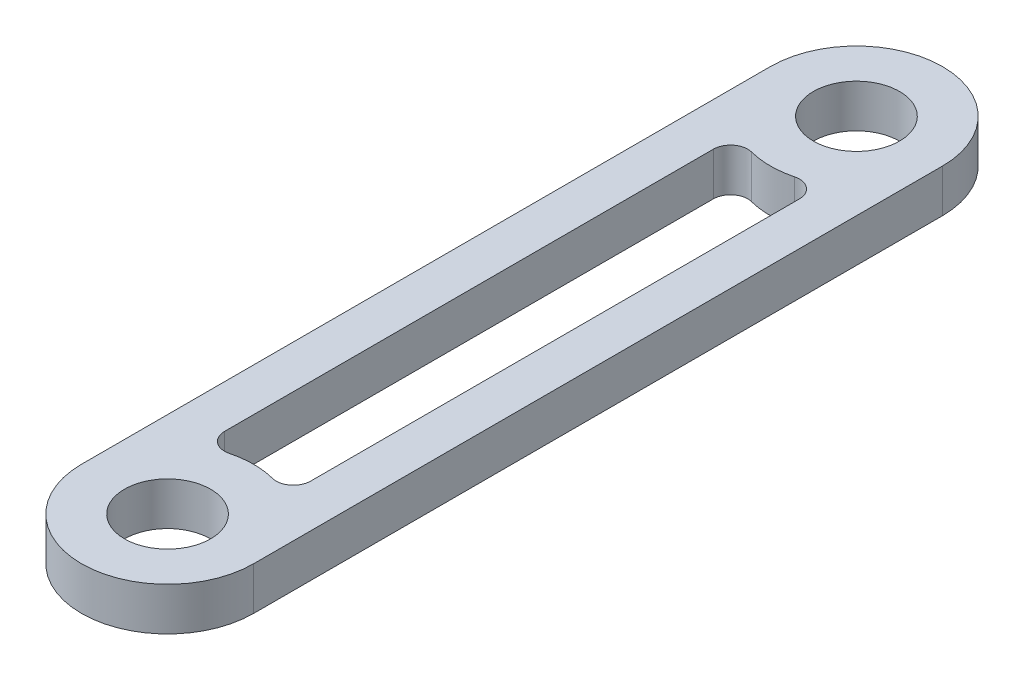
ISO-10303-21;
HEADER;
FILE_DESCRIPTION(('STEP AP214'),'2;1');
FILE_NAME('part.step','',(''),(''),'','','');
FILE_SCHEMA(('AUTOMOTIVE_DESIGN { 1 0 10303 214 1 1 1 1 }'));
ENDSEC;
DATA;
#1=APPLICATION_CONTEXT('core data for automotive mechanical design processes');
#2=APPLICATION_PROTOCOL_DEFINITION('international standard','automotive_design',2000,#1);
#3=PRODUCT_CONTEXT('',#1,'mechanical');
#4=PRODUCT('Part','Part','',(#3));
#5=PRODUCT_RELATED_PRODUCT_CATEGORY('part','',(#4));
#6=PRODUCT_DEFINITION_FORMATION('','',#4);
#7=PRODUCT_DEFINITION_CONTEXT('part definition',#1,'design');
#8=PRODUCT_DEFINITION('design','',#6,#7);
#9=PRODUCT_DEFINITION_SHAPE('','',#8);
#10=(LENGTH_UNIT() NAMED_UNIT(*) SI_UNIT(.MILLI.,.METRE.));
#11=(NAMED_UNIT(*) PLANE_ANGLE_UNIT() SI_UNIT($,.RADIAN.));
#12=(NAMED_UNIT(*) SI_UNIT($,.STERADIAN.) SOLID_ANGLE_UNIT());
#13=UNCERTAINTY_MEASURE_WITH_UNIT(LENGTH_MEASURE(1.E-05),#10,'distance_accuracy_value','');
#14=(GEOMETRIC_REPRESENTATION_CONTEXT(3) GLOBAL_UNCERTAINTY_ASSIGNED_CONTEXT((#13)) GLOBAL_UNIT_ASSIGNED_CONTEXT((#10,
#11,#12)) REPRESENTATION_CONTEXT('',''));
#15=CARTESIAN_POINT('',(0.,0.,0.));
#16=DIRECTION('',(0.,0.,1.));
#17=DIRECTION('',(1.,0.,0.));
#18=AXIS2_PLACEMENT_3D('',#15,#16,#17);
#19=CARTESIAN_POINT('',(0.,5.,0.));
#20=DIRECTION('',(0.,1.,0.));
#21=DIRECTION('',(0.,0.,1.));
#22=AXIS2_PLACEMENT_3D('',#19,#20,#21);
#23=PLANE('',#22);
#24=CARTESIAN_POINT('',(0.,5.,-80.));
#25=DIRECTION('',(0.,1.,0.));
#26=DIRECTION('',(0.,0.,1.));
#27=AXIS2_PLACEMENT_3D('',#24,#25,#26);
#28=CIRCLE('',#27,5.);
#29=CARTESIAN_POINT('',(0.,5.,-75.));
#30=VERTEX_POINT('',#29);
#31=EDGE_CURVE('E230',#30,#30,#28,.T.);
#32=ORIENTED_EDGE('',*,*,#31,.F.);
#33=EDGE_LOOP('',(#32));
#34=FACE_BOUND('',#33,.T.);
#35=CARTESIAN_POINT('',(0.,5.,0.));
#36=DIRECTION('',(0.,1.,0.));
#37=DIRECTION('',(0.,0.,1.));
#38=AXIS2_PLACEMENT_3D('',#35,#36,#37);
#39=CIRCLE('',#38,5.);
#40=CARTESIAN_POINT('',(0.,5.,5.));
#41=VERTEX_POINT('',#40);
#42=EDGE_CURVE('E153',#41,#41,#39,.T.);
#43=ORIENTED_EDGE('',*,*,#42,.F.);
#44=EDGE_LOOP('',(#43));
#45=FACE_BOUND('',#44,.T.);
#46=DIRECTION('',(0.,0.,1.));
#47=VECTOR('',#46,1.);
#48=CARTESIAN_POINT('',(-10.,5.,0.));
#49=LINE('',#48,#47);
#50=CARTESIAN_POINT('',(-10.,5.,-80.));
#51=VERTEX_POINT('',#50);
#52=CARTESIAN_POINT('',(-10.,5.,0.));
#53=VERTEX_POINT('',#52);
#54=EDGE_CURVE('E145',#51,#53,#49,.T.);
#55=ORIENTED_EDGE('',*,*,#54,.T.);
#56=CARTESIAN_POINT('',(0.,5.,0.));
#57=DIRECTION('',(0.,1.,0.));
#58=DIRECTION('',(0.,0.,1.));
#59=AXIS2_PLACEMENT_3D('',#56,#57,#58);
#60=CIRCLE('',#59,10.);
#61=CARTESIAN_POINT('',(10.,5.,0.));
#62=VERTEX_POINT('',#61);
#63=EDGE_CURVE('E135',#53,#62,#60,.T.);
#64=ORIENTED_EDGE('',*,*,#63,.T.);
#65=DIRECTION('',(0.,0.,1.));
#66=VECTOR('',#65,1.);
#67=CARTESIAN_POINT('',(10.,5.,0.));
#68=LINE('',#67,#66);
#69=CARTESIAN_POINT('',(10.,5.,-80.));
#70=VERTEX_POINT('',#69);
#71=EDGE_CURVE('E141',#70,#62,#68,.T.);
#72=ORIENTED_EDGE('',*,*,#71,.F.);
#73=CARTESIAN_POINT('',(0.,5.,-80.));
#74=DIRECTION('',(0.,1.,0.));
#75=DIRECTION('',(0.,0.,1.));
#76=AXIS2_PLACEMENT_3D('',#73,#74,#75);
#77=CIRCLE('',#76,10.);
#78=EDGE_CURVE('E149',#70,#51,#77,.T.);
#79=ORIENTED_EDGE('',*,*,#78,.T.);
#80=EDGE_LOOP('',(#55,#64,#72,#79));
#81=FACE_BOUND('',#80,.T.);
#82=DIRECTION('',(0.,0.,1.));
#83=VECTOR('',#82,1.);
#84=CARTESIAN_POINT('',(-5.,5.,0.));
#85=LINE('',#84,#83);
#86=CARTESIAN_POINT('',(-5.00000000000001,5.,-68.3810499613777));
#87=VERTEX_POINT('',#86);
#88=CARTESIAN_POINT('',(-5.,5.,-11.6189500386223));
#89=VERTEX_POINT('',#88);
#90=EDGE_CURVE('E197',#87,#89,#85,.T.);
#91=ORIENTED_EDGE('',*,*,#90,.F.);
#92=CARTESIAN_POINT('',(-3.00000000000001,5.,-68.3810499613777));
#93=DIRECTION('',(0.,1.,0.));
#94=DIRECTION('',(0.,0.,1.));
#95=AXIS2_PLACEMENT_3D('',#92,#93,#94);
#96=CIRCLE('',#95,2.);
#97=CARTESIAN_POINT('',(-2.50000000000001,5.,-70.3175416344814));
#98=VERTEX_POINT('',#97);
#99=EDGE_CURVE('E51',#87,#98,#96,.F.);
#100=ORIENTED_EDGE('',*,*,#99,.T.);
#101=CARTESIAN_POINT('',(0.,5.,-80.));
#102=DIRECTION('',(0.,1.,0.));
#103=DIRECTION('',(0.,0.,1.));
#104=AXIS2_PLACEMENT_3D('',#101,#102,#103);
#105=CIRCLE('',#104,10.);
#106=CARTESIAN_POINT('',(2.5,5.,-70.3175416344814));
#107=VERTEX_POINT('',#106);
#108=EDGE_CURVE('E198',#98,#107,#105,.T.);
#109=ORIENTED_EDGE('',*,*,#108,.T.);
#110=CARTESIAN_POINT('',(3.,5.,-68.3810499613777));
#111=DIRECTION('',(0.,1.,0.));
#112=DIRECTION('',(0.,0.,1.));
#113=AXIS2_PLACEMENT_3D('',#110,#111,#112);
#114=CIRCLE('',#113,2.);
#115=CARTESIAN_POINT('',(5.,5.,-68.3810499613777));
#116=VERTEX_POINT('',#115);
#117=EDGE_CURVE('E185',#107,#116,#114,.F.);
#118=ORIENTED_EDGE('',*,*,#117,.T.);
#119=DIRECTION('',(0.,0.,1.));
#120=VECTOR('',#119,1.);
#121=CARTESIAN_POINT('',(5.00000000000001,5.,0.));
#122=LINE('',#121,#120);
#123=CARTESIAN_POINT('',(5.00000000000001,5.,-11.6189500386222));
#124=VERTEX_POINT('',#123);
#125=EDGE_CURVE('E214',#116,#124,#122,.T.);
#126=ORIENTED_EDGE('',*,*,#125,.T.);
#127=CARTESIAN_POINT('',(3.00000000000001,5.,-11.6189500386222));
#128=DIRECTION('',(0.,1.,0.));
#129=DIRECTION('',(0.,0.,1.));
#130=AXIS2_PLACEMENT_3D('',#127,#128,#129);
#131=CIRCLE('',#130,2.);
#132=CARTESIAN_POINT('',(2.50000000000001,5.,-9.68245836551854));
#133=VERTEX_POINT('',#132);
#134=EDGE_CURVE('E188',#124,#133,#131,.F.);
#135=ORIENTED_EDGE('',*,*,#134,.T.);
#136=CARTESIAN_POINT('',(0.,5.,0.));
#137=DIRECTION('',(0.,1.,0.));
#138=DIRECTION('',(0.,0.,1.));
#139=AXIS2_PLACEMENT_3D('',#136,#137,#138);
#140=CIRCLE('',#139,10.);
#141=CARTESIAN_POINT('',(-2.5,5.,-9.68245836551854));
#142=VERTEX_POINT('',#141);
#143=EDGE_CURVE('E225',#133,#142,#140,.T.);
#144=ORIENTED_EDGE('',*,*,#143,.T.);
#145=CARTESIAN_POINT('',(-3.,5.,-11.6189500386223));
#146=DIRECTION('',(0.,1.,0.));
#147=DIRECTION('',(0.,0.,1.));
#148=AXIS2_PLACEMENT_3D('',#145,#146,#147);
#149=CIRCLE('',#148,2.);
#150=EDGE_CURVE('E187',#142,#89,#149,.F.);
#151=ORIENTED_EDGE('',*,*,#150,.T.);
#152=EDGE_LOOP('',(#91,#100,#109,#118,#126,#135,#144,#151));
#153=FACE_BOUND('',#152,.T.);
#154=ADVANCED_FACE('F43',(#34,#45,#81,#153),#23,.T.);
#155=CARTESIAN_POINT('',(0.,0.,0.));
#156=DIRECTION('',(0.,1.,0.));
#157=DIRECTION('',(0.,0.,1.));
#158=AXIS2_PLACEMENT_3D('',#155,#156,#157);
#159=PLANE('',#158);
#160=DIRECTION('',(0.,0.,1.));
#161=VECTOR('',#160,1.);
#162=CARTESIAN_POINT('',(-10.,0.,0.));
#163=LINE('',#162,#161);
#164=CARTESIAN_POINT('',(-10.,0.,-80.));
#165=VERTEX_POINT('',#164);
#166=CARTESIAN_POINT('',(-10.,0.,0.));
#167=VERTEX_POINT('',#166);
#168=EDGE_CURVE('E160',#165,#167,#163,.T.);
#169=ORIENTED_EDGE('',*,*,#168,.F.);
#170=CARTESIAN_POINT('',(0.,0.,-80.));
#171=DIRECTION('',(0.,1.,0.));
#172=DIRECTION('',(0.,0.,1.));
#173=AXIS2_PLACEMENT_3D('',#170,#171,#172);
#174=CIRCLE('',#173,10.);
#175=CARTESIAN_POINT('',(10.,0.,-80.));
#176=VERTEX_POINT('',#175);
#177=EDGE_CURVE('E227',#176,#165,#174,.T.);
#178=ORIENTED_EDGE('',*,*,#177,.F.);
#179=DIRECTION('',(0.,0.,1.));
#180=VECTOR('',#179,1.);
#181=CARTESIAN_POINT('',(10.,0.,0.));
#182=LINE('',#181,#180);
#183=CARTESIAN_POINT('',(10.,0.,0.));
#184=VERTEX_POINT('',#183);
#185=EDGE_CURVE('E244',#176,#184,#182,.T.);
#186=ORIENTED_EDGE('',*,*,#185,.T.);
#187=CARTESIAN_POINT('',(0.,0.,0.));
#188=DIRECTION('',(0.,1.,0.));
#189=DIRECTION('',(0.,0.,1.));
#190=AXIS2_PLACEMENT_3D('',#187,#188,#189);
#191=CIRCLE('',#190,10.);
#192=EDGE_CURVE('E245',#167,#184,#191,.T.);
#193=ORIENTED_EDGE('',*,*,#192,.F.);
#194=EDGE_LOOP('',(#169,#178,#186,#193));
#195=FACE_BOUND('',#194,.T.);
#196=CARTESIAN_POINT('',(0.,0.,0.));
#197=DIRECTION('',(0.,1.,0.));
#198=DIRECTION('',(0.,0.,1.));
#199=AXIS2_PLACEMENT_3D('',#196,#197,#198);
#200=CIRCLE('',#199,5.);
#201=CARTESIAN_POINT('',(0.,0.,5.));
#202=VERTEX_POINT('',#201);
#203=EDGE_CURVE('E236',#202,#202,#200,.T.);
#204=ORIENTED_EDGE('',*,*,#203,.T.);
#205=EDGE_LOOP('',(#204));
#206=FACE_BOUND('',#205,.T.);
#207=CARTESIAN_POINT('',(0.,0.,-80.));
#208=DIRECTION('',(0.,1.,0.));
#209=DIRECTION('',(0.,0.,1.));
#210=AXIS2_PLACEMENT_3D('',#207,#208,#209);
#211=CIRCLE('',#210,5.);
#212=CARTESIAN_POINT('',(0.,0.,-75.));
#213=VERTEX_POINT('',#212);
#214=EDGE_CURVE('E218',#213,#213,#211,.T.);
#215=ORIENTED_EDGE('',*,*,#214,.T.);
#216=EDGE_LOOP('',(#215));
#217=FACE_BOUND('',#216,.T.);
#218=CARTESIAN_POINT('',(0.,0.,-80.));
#219=DIRECTION('',(0.,1.,0.));
#220=DIRECTION('',(0.,0.,1.));
#221=AXIS2_PLACEMENT_3D('',#218,#219,#220);
#222=CIRCLE('',#221,10.);
#223=CARTESIAN_POINT('',(-2.50000000000001,0.,-70.3175416344814));
#224=VERTEX_POINT('',#223);
#225=CARTESIAN_POINT('',(2.5,0.,-70.3175416344814));
#226=VERTEX_POINT('',#225);
#227=EDGE_CURVE('E209',#224,#226,#222,.T.);
#228=ORIENTED_EDGE('',*,*,#227,.F.);
#229=CARTESIAN_POINT('',(-3.00000000000001,0.,-68.3810499613777));
#230=DIRECTION('',(0.,1.,0.));
#231=DIRECTION('',(0.,0.,1.));
#232=AXIS2_PLACEMENT_3D('',#229,#230,#231);
#233=CIRCLE('',#232,2.);
#234=CARTESIAN_POINT('',(-5.00000000000001,0.,-68.3810499613777));
#235=VERTEX_POINT('',#234);
#236=EDGE_CURVE('E11',#224,#235,#233,.T.);
#237=ORIENTED_EDGE('',*,*,#236,.T.);
#238=DIRECTION('',(0.,0.,1.));
#239=VECTOR('',#238,1.);
#240=CARTESIAN_POINT('',(-5.,0.,0.));
#241=LINE('',#240,#239);
#242=CARTESIAN_POINT('',(-5.,0.,-11.6189500386223));
#243=VERTEX_POINT('',#242);
#244=EDGE_CURVE('E210',#235,#243,#241,.T.);
#245=ORIENTED_EDGE('',*,*,#244,.T.);
#246=CARTESIAN_POINT('',(-3.,0.,-11.6189500386223));
#247=DIRECTION('',(0.,1.,0.));
#248=DIRECTION('',(0.,0.,1.));
#249=AXIS2_PLACEMENT_3D('',#246,#247,#248);
#250=CIRCLE('',#249,2.);
#251=CARTESIAN_POINT('',(-2.5,0.,-9.68245836551854));
#252=VERTEX_POINT('',#251);
#253=EDGE_CURVE('E195',#243,#252,#250,.T.);
#254=ORIENTED_EDGE('',*,*,#253,.T.);
#255=CARTESIAN_POINT('',(0.,0.,0.));
#256=DIRECTION('',(0.,1.,0.));
#257=DIRECTION('',(0.,0.,1.));
#258=AXIS2_PLACEMENT_3D('',#255,#256,#257);
#259=CIRCLE('',#258,10.);
#260=CARTESIAN_POINT('',(2.50000000000001,0.,-9.68245836551854));
#261=VERTEX_POINT('',#260);
#262=EDGE_CURVE('E207',#261,#252,#259,.T.);
#263=ORIENTED_EDGE('',*,*,#262,.F.);
#264=CARTESIAN_POINT('',(3.00000000000001,0.,-11.6189500386222));
#265=DIRECTION('',(0.,1.,0.));
#266=DIRECTION('',(0.,0.,1.));
#267=AXIS2_PLACEMENT_3D('',#264,#265,#266);
#268=CIRCLE('',#267,2.);
#269=CARTESIAN_POINT('',(5.00000000000001,0.,-11.6189500386222));
#270=VERTEX_POINT('',#269);
#271=EDGE_CURVE('E186',#261,#270,#268,.T.);
#272=ORIENTED_EDGE('',*,*,#271,.T.);
#273=DIRECTION('',(0.,0.,1.));
#274=VECTOR('',#273,1.);
#275=CARTESIAN_POINT('',(5.00000000000001,0.,0.));
#276=LINE('',#275,#274);
#277=CARTESIAN_POINT('',(5.,0.,-68.3810499613777));
#278=VERTEX_POINT('',#277);
#279=EDGE_CURVE('E213',#278,#270,#276,.T.);
#280=ORIENTED_EDGE('',*,*,#279,.F.);
#281=CARTESIAN_POINT('',(3.,0.,-68.3810499613777));
#282=DIRECTION('',(0.,1.,0.));
#283=DIRECTION('',(0.,0.,1.));
#284=AXIS2_PLACEMENT_3D('',#281,#282,#283);
#285=CIRCLE('',#284,2.);
#286=EDGE_CURVE('E184',#278,#226,#285,.T.);
#287=ORIENTED_EDGE('',*,*,#286,.T.);
#288=EDGE_LOOP('',(#228,#237,#245,#254,#263,#272,#280,#287));
#289=FACE_BOUND('',#288,.T.);
#290=ADVANCED_FACE('F255',(#195,#206,#217,#289),#159,.F.);
#291=CARTESIAN_POINT('',(-10.,5.,0.));
#292=DIRECTION('',(1.,0.,0.));
#293=DIRECTION('',(0.,0.,-1.));
#294=AXIS2_PLACEMENT_3D('',#291,#292,#293);
#295=PLANE('',#294);
#296=ORIENTED_EDGE('',*,*,#168,.T.);
#297=DIRECTION('',(0.,-1.,0.));
#298=VECTOR('',#297,1.);
#299=CARTESIAN_POINT('',(-10.,5.,0.));
#300=LINE('',#299,#298);
#301=EDGE_CURVE('E140',#53,#167,#300,.T.);
#302=ORIENTED_EDGE('',*,*,#301,.F.);
#303=ORIENTED_EDGE('',*,*,#54,.F.);
#304=DIRECTION('',(0.,-1.,0.));
#305=VECTOR('',#304,1.);
#306=CARTESIAN_POINT('',(-10.,5.,-80.));
#307=LINE('',#306,#305);
#308=EDGE_CURVE('E234',#51,#165,#307,.T.);
#309=ORIENTED_EDGE('',*,*,#308,.T.);
#310=EDGE_LOOP('',(#296,#302,#303,#309));
#311=FACE_BOUND('',#310,.T.);
#312=ADVANCED_FACE('F154',(#311),#295,.F.);
#313=CARTESIAN_POINT('',(0.,5.,0.));
#314=DIRECTION('',(0.,-1.,0.));
#315=DIRECTION('',(0.,0.,-1.));
#316=AXIS2_PLACEMENT_3D('',#313,#314,#315);
#317=CYLINDRICAL_SURFACE('',#316,10.);
#318=ORIENTED_EDGE('',*,*,#192,.T.);
#319=DIRECTION('',(0.,-1.,0.));
#320=VECTOR('',#319,1.);
#321=CARTESIAN_POINT('',(10.,5.,0.));
#322=LINE('',#321,#320);
#323=EDGE_CURVE('E137',#62,#184,#322,.T.);
#324=ORIENTED_EDGE('',*,*,#323,.F.);
#325=ORIENTED_EDGE('',*,*,#63,.F.);
#326=ORIENTED_EDGE('',*,*,#301,.T.);
#327=EDGE_LOOP('',(#318,#324,#325,#326));
#328=FACE_BOUND('',#327,.T.);
#329=ADVANCED_FACE('F132',(#328),#317,.T.);
#330=CARTESIAN_POINT('',(10.,5.,0.));
#331=DIRECTION('',(1.,0.,0.));
#332=DIRECTION('',(0.,0.,-1.));
#333=AXIS2_PLACEMENT_3D('',#330,#331,#332);
#334=PLANE('',#333);
#335=ORIENTED_EDGE('',*,*,#185,.F.);
#336=DIRECTION('',(0.,-1.,0.));
#337=VECTOR('',#336,1.);
#338=CARTESIAN_POINT('',(10.,5.,-80.));
#339=LINE('',#338,#337);
#340=EDGE_CURVE('E165',#70,#176,#339,.T.);
#341=ORIENTED_EDGE('',*,*,#340,.F.);
#342=ORIENTED_EDGE('',*,*,#71,.T.);
#343=ORIENTED_EDGE('',*,*,#323,.T.);
#344=EDGE_LOOP('',(#335,#341,#342,#343));
#345=FACE_BOUND('',#344,.T.);
#346=ADVANCED_FACE('F258',(#345),#334,.T.);
#347=CARTESIAN_POINT('',(0.,5.,0.));
#348=DIRECTION('',(0.,-1.,0.));
#349=DIRECTION('',(0.,0.,-1.));
#350=AXIS2_PLACEMENT_3D('',#347,#348,#349);
#351=CYLINDRICAL_SURFACE('',#350,5.);
#352=ORIENTED_EDGE('',*,*,#42,.T.);
#353=EDGE_LOOP('',(#352));
#354=FACE_BOUND('',#353,.T.);
#355=ORIENTED_EDGE('',*,*,#203,.F.);
#356=EDGE_LOOP('',(#355));
#357=FACE_BOUND('',#356,.T.);
#358=ADVANCED_FACE('F256',(#354,#357),#351,.F.);
#359=CARTESIAN_POINT('',(0.,5.,-80.));
#360=DIRECTION('',(0.,-1.,0.));
#361=DIRECTION('',(0.,0.,-1.));
#362=AXIS2_PLACEMENT_3D('',#359,#360,#361);
#363=CYLINDRICAL_SURFACE('',#362,5.);
#364=ORIENTED_EDGE('',*,*,#31,.T.);
#365=EDGE_LOOP('',(#364));
#366=FACE_BOUND('',#365,.T.);
#367=ORIENTED_EDGE('',*,*,#214,.F.);
#368=EDGE_LOOP('',(#367));
#369=FACE_BOUND('',#368,.T.);
#370=ADVANCED_FACE('F262',(#366,#369),#363,.F.);
#371=CARTESIAN_POINT('',(0.,5.,-80.));
#372=DIRECTION('',(0.,-1.,0.));
#373=DIRECTION('',(0.,0.,-1.));
#374=AXIS2_PLACEMENT_3D('',#371,#372,#373);
#375=CYLINDRICAL_SURFACE('',#374,10.);
#376=ORIENTED_EDGE('',*,*,#177,.T.);
#377=ORIENTED_EDGE('',*,*,#308,.F.);
#378=ORIENTED_EDGE('',*,*,#78,.F.);
#379=ORIENTED_EDGE('',*,*,#340,.T.);
#380=EDGE_LOOP('',(#376,#377,#378,#379));
#381=FACE_BOUND('',#380,.T.);
#382=ADVANCED_FACE('F249',(#381),#375,.T.);
#383=CARTESIAN_POINT('',(0.,0.,-80.));
#384=DIRECTION('',(0.,1.,0.));
#385=DIRECTION('',(0.,0.,1.));
#386=AXIS2_PLACEMENT_3D('',#383,#384,#385);
#387=CYLINDRICAL_SURFACE('',#386,10.);
#388=ORIENTED_EDGE('',*,*,#227,.T.);
#389=DIRECTION('',(0.,1.,0.));
#390=VECTOR('',#389,1.);
#391=CARTESIAN_POINT('',(2.5,0.,-70.3175416344814));
#392=LINE('',#391,#390);
#393=EDGE_CURVE('E159',#226,#107,#392,.T.);
#394=ORIENTED_EDGE('',*,*,#393,.T.);
#395=ORIENTED_EDGE('',*,*,#108,.F.);
#396=DIRECTION('',(0.,1.,0.));
#397=VECTOR('',#396,1.);
#398=CARTESIAN_POINT('',(-2.50000000000001,0.,-70.3175416344814));
#399=LINE('',#398,#397);
#400=EDGE_CURVE('E158',#98,#224,#399,.F.);
#401=ORIENTED_EDGE('',*,*,#400,.T.);
#402=EDGE_LOOP('',(#388,#394,#395,#401));
#403=FACE_BOUND('',#402,.T.);
#404=ADVANCED_FACE('F201',(#403),#387,.T.);
#405=CARTESIAN_POINT('',(5.00000000000001,0.,0.));
#406=DIRECTION('',(-1.,0.,0.));
#407=DIRECTION('',(0.,0.,1.));
#408=AXIS2_PLACEMENT_3D('',#405,#406,#407);
#409=PLANE('',#408);
#410=ORIENTED_EDGE('',*,*,#125,.F.);
#411=DIRECTION('',(0.,-1.,0.));
#412=VECTOR('',#411,1.);
#413=CARTESIAN_POINT('',(5.,0.,-68.3810499613777));
#414=LINE('',#413,#412);
#415=EDGE_CURVE('E173',#116,#278,#414,.T.);
#416=ORIENTED_EDGE('',*,*,#415,.T.);
#417=ORIENTED_EDGE('',*,*,#279,.T.);
#418=DIRECTION('',(0.,-1.,0.));
#419=VECTOR('',#418,1.);
#420=CARTESIAN_POINT('',(5.00000000000001,5.,-11.6189500386222));
#421=LINE('',#420,#419);
#422=EDGE_CURVE('E169',#270,#124,#421,.F.);
#423=ORIENTED_EDGE('',*,*,#422,.T.);
#424=EDGE_LOOP('',(#410,#416,#417,#423));
#425=FACE_BOUND('',#424,.T.);
#426=ADVANCED_FACE('F282',(#425),#409,.T.);
#427=CARTESIAN_POINT('',(0.,0.,0.));
#428=DIRECTION('',(0.,1.,0.));
#429=DIRECTION('',(0.,0.,1.));
#430=AXIS2_PLACEMENT_3D('',#427,#428,#429);
#431=CYLINDRICAL_SURFACE('',#430,10.);
#432=ORIENTED_EDGE('',*,*,#143,.F.);
#433=DIRECTION('',(0.,1.,0.));
#434=VECTOR('',#433,1.);
#435=CARTESIAN_POINT('',(2.50000000000001,0.,-9.68245836551854));
#436=LINE('',#435,#434);
#437=EDGE_CURVE('E176',#133,#261,#436,.F.);
#438=ORIENTED_EDGE('',*,*,#437,.T.);
#439=ORIENTED_EDGE('',*,*,#262,.T.);
#440=DIRECTION('',(0.,1.,0.));
#441=VECTOR('',#440,1.);
#442=CARTESIAN_POINT('',(-2.5,0.,-9.68245836551854));
#443=LINE('',#442,#441);
#444=EDGE_CURVE('E171',#252,#142,#443,.T.);
#445=ORIENTED_EDGE('',*,*,#444,.T.);
#446=EDGE_LOOP('',(#432,#438,#439,#445));
#447=FACE_BOUND('',#446,.T.);
#448=ADVANCED_FACE('F313',(#447),#431,.T.);
#449=CARTESIAN_POINT('',(-5.,0.,0.));
#450=DIRECTION('',(-1.,0.,0.));
#451=DIRECTION('',(0.,0.,1.));
#452=AXIS2_PLACEMENT_3D('',#449,#450,#451);
#453=PLANE('',#452);
#454=ORIENTED_EDGE('',*,*,#90,.T.);
#455=DIRECTION('',(0.,1.,0.));
#456=VECTOR('',#455,1.);
#457=CARTESIAN_POINT('',(-5.,0.,-11.6189500386223));
#458=LINE('',#457,#456);
#459=EDGE_CURVE('E59',#89,#243,#458,.F.);
#460=ORIENTED_EDGE('',*,*,#459,.T.);
#461=ORIENTED_EDGE('',*,*,#244,.F.);
#462=DIRECTION('',(0.,1.,0.));
#463=VECTOR('',#462,1.);
#464=CARTESIAN_POINT('',(-5.00000000000001,0.,-68.3810499613777));
#465=LINE('',#464,#463);
#466=EDGE_CURVE('E178',#235,#87,#465,.T.);
#467=ORIENTED_EDGE('',*,*,#466,.T.);
#468=EDGE_LOOP('',(#454,#460,#461,#467));
#469=FACE_BOUND('',#468,.T.);
#470=ADVANCED_FACE('F206',(#469),#453,.F.);
#471=CARTESIAN_POINT('',(3.,0.,-68.3810499613777));
#472=DIRECTION('',(0.,1.,0.));
#473=DIRECTION('',(0.,0.,1.));
#474=AXIS2_PLACEMENT_3D('',#471,#472,#473);
#475=CYLINDRICAL_SURFACE('',#474,2.);
#476=ORIENTED_EDGE('',*,*,#286,.F.);
#477=ORIENTED_EDGE('',*,*,#415,.F.);
#478=ORIENTED_EDGE('',*,*,#117,.F.);
#479=ORIENTED_EDGE('',*,*,#393,.F.);
#480=EDGE_LOOP('',(#476,#477,#478,#479));
#481=FACE_BOUND('',#480,.T.);
#482=ADVANCED_FACE('F291',(#481),#475,.F.);
#483=CARTESIAN_POINT('',(3.00000000000001,0.,-11.6189500386222));
#484=DIRECTION('',(0.,1.,0.));
#485=DIRECTION('',(0.,0.,1.));
#486=AXIS2_PLACEMENT_3D('',#483,#484,#485);
#487=CYLINDRICAL_SURFACE('',#486,2.);
#488=ORIENTED_EDGE('',*,*,#271,.F.);
#489=ORIENTED_EDGE('',*,*,#437,.F.);
#490=ORIENTED_EDGE('',*,*,#134,.F.);
#491=ORIENTED_EDGE('',*,*,#422,.F.);
#492=EDGE_LOOP('',(#488,#489,#490,#491));
#493=FACE_BOUND('',#492,.T.);
#494=ADVANCED_FACE('F298',(#493),#487,.F.);
#495=CARTESIAN_POINT('',(-3.,0.,-11.6189500386223));
#496=DIRECTION('',(0.,1.,0.));
#497=DIRECTION('',(0.,0.,1.));
#498=AXIS2_PLACEMENT_3D('',#495,#496,#497);
#499=CYLINDRICAL_SURFACE('',#498,2.);
#500=ORIENTED_EDGE('',*,*,#253,.F.);
#501=ORIENTED_EDGE('',*,*,#459,.F.);
#502=ORIENTED_EDGE('',*,*,#150,.F.);
#503=ORIENTED_EDGE('',*,*,#444,.F.);
#504=EDGE_LOOP('',(#500,#501,#502,#503));
#505=FACE_BOUND('',#504,.T.);
#506=ADVANCED_FACE('F299',(#505),#499,.F.);
#507=CARTESIAN_POINT('',(-3.00000000000001,0.,-68.3810499613777));
#508=DIRECTION('',(0.,1.,0.));
#509=DIRECTION('',(0.,0.,1.));
#510=AXIS2_PLACEMENT_3D('',#507,#508,#509);
#511=CYLINDRICAL_SURFACE('',#510,2.);
#512=ORIENTED_EDGE('',*,*,#236,.F.);
#513=ORIENTED_EDGE('',*,*,#400,.F.);
#514=ORIENTED_EDGE('',*,*,#99,.F.);
#515=ORIENTED_EDGE('',*,*,#466,.F.);
#516=EDGE_LOOP('',(#512,#513,#514,#515));
#517=FACE_BOUND('',#516,.T.);
#518=ADVANCED_FACE('F44',(#517),#511,.F.);
#519=CLOSED_SHELL('',(#154,#290,#312,#329,#346,#358,#370,#382,#404,#426,#448,#470,#482,#494,
#506,#518));
#520=MANIFOLD_SOLID_BREP('B2',#519);
#521=ADVANCED_BREP_SHAPE_REPRESENTATION('',(#18,#520),#14);
#522=SHAPE_DEFINITION_REPRESENTATION(#9,#521);
ENDSEC;
END-ISO-10303-21;
